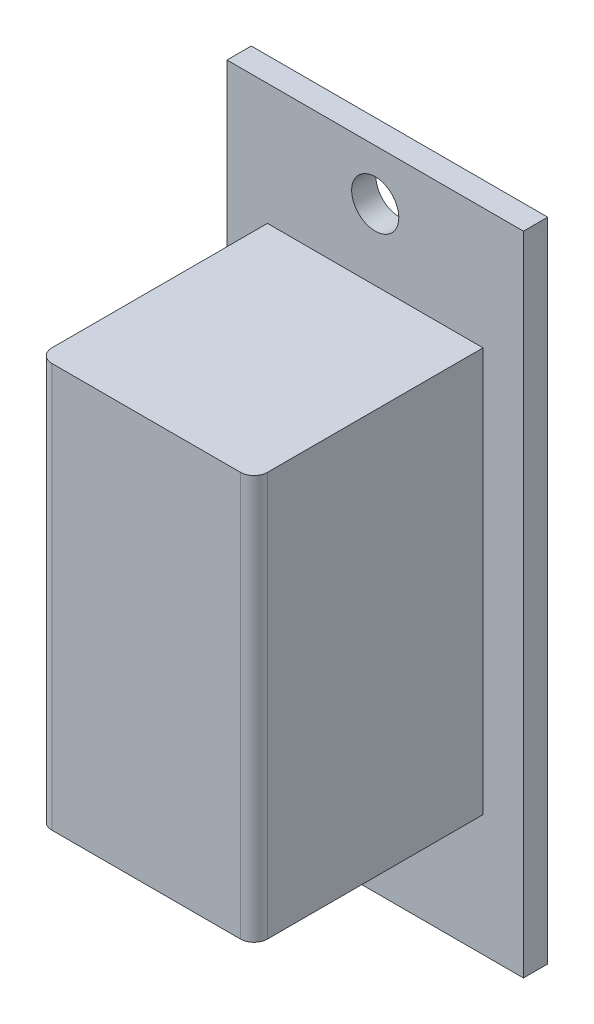
ISO-10303-21;
HEADER;
FILE_DESCRIPTION(('STEP AP214'),'2;1');
FILE_NAME('part.step','',(''),(''),'','','');
FILE_SCHEMA(('AUTOMOTIVE_DESIGN { 1 0 10303 214 1 1 1 1 }'));
ENDSEC;
DATA;
#1=APPLICATION_CONTEXT('core data for automotive mechanical design processes');
#2=APPLICATION_PROTOCOL_DEFINITION('international standard','automotive_design',2000,#1);
#3=PRODUCT_CONTEXT('',#1,'mechanical');
#4=PRODUCT('Part','Part','',(#3));
#5=PRODUCT_RELATED_PRODUCT_CATEGORY('part','',(#4));
#6=PRODUCT_DEFINITION_FORMATION('','',#4);
#7=PRODUCT_DEFINITION_CONTEXT('part definition',#1,'design');
#8=PRODUCT_DEFINITION('design','',#6,#7);
#9=PRODUCT_DEFINITION_SHAPE('','',#8);
#10=(LENGTH_UNIT() NAMED_UNIT(*) SI_UNIT(.MILLI.,.METRE.));
#11=(NAMED_UNIT(*) PLANE_ANGLE_UNIT() SI_UNIT($,.RADIAN.));
#12=(NAMED_UNIT(*) SI_UNIT($,.STERADIAN.) SOLID_ANGLE_UNIT());
#13=UNCERTAINTY_MEASURE_WITH_UNIT(LENGTH_MEASURE(1.E-05),#10,'distance_accuracy_value','');
#14=(GEOMETRIC_REPRESENTATION_CONTEXT(3) GLOBAL_UNCERTAINTY_ASSIGNED_CONTEXT((#13)) GLOBAL_UNIT_ASSIGNED_CONTEXT((#10,
#11,#12)) REPRESENTATION_CONTEXT('',''));
#15=CARTESIAN_POINT('',(0.,0.,0.));
#16=DIRECTION('',(0.,0.,1.));
#17=DIRECTION('',(1.,0.,0.));
#18=AXIS2_PLACEMENT_3D('',#15,#16,#17);
#19=CARTESIAN_POINT('',(-11.,-24.,1.8));
#20=DIRECTION('',(0.,0.,1.));
#21=DIRECTION('',(1.,0.,0.));
#22=AXIS2_PLACEMENT_3D('',#19,#20,#21);
#23=PLANE('',#22);
#24=CARTESIAN_POINT('',(0.,-20.25,1.8));
#25=DIRECTION('',(0.,0.,1.));
#26=DIRECTION('',(-1.,0.,0.));
#27=AXIS2_PLACEMENT_3D('',#24,#25,#26);
#28=CIRCLE('',#27,1.75);
#29=CARTESIAN_POINT('',(-1.75,-20.25,1.8));
#30=VERTEX_POINT('',#29);
#31=EDGE_CURVE('E144',#30,#30,#28,.T.);
#32=ORIENTED_EDGE('',*,*,#31,.F.);
#33=EDGE_LOOP('',(#32));
#34=FACE_BOUND('',#33,.T.);
#35=DIRECTION('',(0.,-1.,0.));
#36=VECTOR('',#35,1.);
#37=CARTESIAN_POINT('',(-11.,24.,1.8));
#38=LINE('',#37,#36);
#39=CARTESIAN_POINT('',(-11.,24.,1.8));
#40=VERTEX_POINT('',#39);
#41=CARTESIAN_POINT('',(-11.,-24.,1.8));
#42=VERTEX_POINT('',#41);
#43=EDGE_CURVE('E162',#40,#42,#38,.T.);
#44=ORIENTED_EDGE('',*,*,#43,.T.);
#45=DIRECTION('',(1.,0.,0.));
#46=VECTOR('',#45,1.);
#47=CARTESIAN_POINT('',(-11.,-24.,1.8));
#48=LINE('',#47,#46);
#49=CARTESIAN_POINT('',(11.,-24.,1.8));
#50=VERTEX_POINT('',#49);
#51=EDGE_CURVE('E165',#42,#50,#48,.T.);
#52=ORIENTED_EDGE('',*,*,#51,.T.);
#53=DIRECTION('',(0.,1.,0.));
#54=VECTOR('',#53,1.);
#55=CARTESIAN_POINT('',(11.,-24.,1.8));
#56=LINE('',#55,#54);
#57=CARTESIAN_POINT('',(11.,24.,1.8));
#58=VERTEX_POINT('',#57);
#59=EDGE_CURVE('E167',#50,#58,#56,.T.);
#60=ORIENTED_EDGE('',*,*,#59,.T.);
#61=DIRECTION('',(-1.,0.,0.));
#62=VECTOR('',#61,1.);
#63=CARTESIAN_POINT('',(-11.,24.,1.8));
#64=LINE('',#63,#62);
#65=EDGE_CURVE('E169',#58,#40,#64,.T.);
#66=ORIENTED_EDGE('',*,*,#65,.T.);
#67=EDGE_LOOP('',(#44,#52,#60,#66));
#68=FACE_BOUND('',#67,.T.);
#69=CARTESIAN_POINT('',(0.,20.25,1.8));
#70=DIRECTION('',(0.,0.,1.));
#71=DIRECTION('',(1.,0.,0.));
#72=AXIS2_PLACEMENT_3D('',#69,#70,#71);
#73=CIRCLE('',#72,1.75);
#74=CARTESIAN_POINT('',(1.75,20.25,1.8));
#75=VERTEX_POINT('',#74);
#76=EDGE_CURVE('E150',#75,#75,#73,.T.);
#77=ORIENTED_EDGE('',*,*,#76,.F.);
#78=EDGE_LOOP('',(#77));
#79=FACE_BOUND('',#78,.T.);
#80=DIRECTION('',(1.,0.,0.));
#81=VECTOR('',#80,1.);
#82=CARTESIAN_POINT('',(-8.,-15.,1.8));
#83=LINE('',#82,#81);
#84=CARTESIAN_POINT('',(-8.,-15.,1.8));
#85=VERTEX_POINT('',#84);
#86=CARTESIAN_POINT('',(8.00000000000001,-15.,1.8));
#87=VERTEX_POINT('',#86);
#88=EDGE_CURVE('E111',#85,#87,#83,.T.);
#89=ORIENTED_EDGE('',*,*,#88,.F.);
#90=DIRECTION('',(0.,-1.,0.));
#91=VECTOR('',#90,1.);
#92=CARTESIAN_POINT('',(-8.,15.,1.8));
#93=LINE('',#92,#91);
#94=CARTESIAN_POINT('',(-8.,15.,1.8));
#95=VERTEX_POINT('',#94);
#96=EDGE_CURVE('E118',#95,#85,#93,.T.);
#97=ORIENTED_EDGE('',*,*,#96,.F.);
#98=DIRECTION('',(-1.,0.,0.));
#99=VECTOR('',#98,1.);
#100=CARTESIAN_POINT('',(-8.,15.,1.8));
#101=LINE('',#100,#99);
#102=CARTESIAN_POINT('',(8.,15.,1.8));
#103=VERTEX_POINT('',#102);
#104=EDGE_CURVE('E128',#103,#95,#101,.T.);
#105=ORIENTED_EDGE('',*,*,#104,.F.);
#106=DIRECTION('',(0.,1.,0.));
#107=VECTOR('',#106,1.);
#108=CARTESIAN_POINT('',(8.00000000000001,-15.,1.8));
#109=LINE('',#108,#107);
#110=EDGE_CURVE('E126',#87,#103,#109,.T.);
#111=ORIENTED_EDGE('',*,*,#110,.F.);
#112=EDGE_LOOP('',(#89,#97,#105,#111));
#113=FACE_BOUND('',#112,.T.);
#114=ADVANCED_FACE('F29',(#34,#68,#79,#113),#23,.T.);
#115=CARTESIAN_POINT('',(-11.,-24.,0.));
#116=DIRECTION('',(0.,0.,1.));
#117=DIRECTION('',(1.,0.,0.));
#118=AXIS2_PLACEMENT_3D('',#115,#116,#117);
#119=PLANE('',#118);
#120=CARTESIAN_POINT('',(0.,20.25,0.));
#121=DIRECTION('',(0.,0.,1.));
#122=DIRECTION('',(1.,0.,0.));
#123=AXIS2_PLACEMENT_3D('',#120,#121,#122);
#124=CIRCLE('',#123,1.75);
#125=CARTESIAN_POINT('',(1.75,20.25,0.));
#126=VERTEX_POINT('',#125);
#127=EDGE_CURVE('E147',#126,#126,#124,.T.);
#128=ORIENTED_EDGE('',*,*,#127,.T.);
#129=EDGE_LOOP('',(#128));
#130=FACE_BOUND('',#129,.T.);
#131=DIRECTION('',(0.,-1.,0.));
#132=VECTOR('',#131,1.);
#133=CARTESIAN_POINT('',(-11.,24.,0.));
#134=LINE('',#133,#132);
#135=CARTESIAN_POINT('',(-11.,24.,0.));
#136=VERTEX_POINT('',#135);
#137=CARTESIAN_POINT('',(-11.,-24.,0.));
#138=VERTEX_POINT('',#137);
#139=EDGE_CURVE('E153',#136,#138,#134,.T.);
#140=ORIENTED_EDGE('',*,*,#139,.F.);
#141=DIRECTION('',(-1.,0.,0.));
#142=VECTOR('',#141,1.);
#143=CARTESIAN_POINT('',(-11.,24.,0.));
#144=LINE('',#143,#142);
#145=CARTESIAN_POINT('',(11.,24.,0.));
#146=VERTEX_POINT('',#145);
#147=EDGE_CURVE('E160',#146,#136,#144,.T.);
#148=ORIENTED_EDGE('',*,*,#147,.F.);
#149=DIRECTION('',(0.,1.,0.));
#150=VECTOR('',#149,1.);
#151=CARTESIAN_POINT('',(11.,-24.,0.));
#152=LINE('',#151,#150);
#153=CARTESIAN_POINT('',(11.,-24.,0.));
#154=VERTEX_POINT('',#153);
#155=EDGE_CURVE('E158',#154,#146,#152,.T.);
#156=ORIENTED_EDGE('',*,*,#155,.F.);
#157=DIRECTION('',(1.,0.,0.));
#158=VECTOR('',#157,1.);
#159=CARTESIAN_POINT('',(-11.,-24.,0.));
#160=LINE('',#159,#158);
#161=EDGE_CURVE('E156',#138,#154,#160,.T.);
#162=ORIENTED_EDGE('',*,*,#161,.F.);
#163=EDGE_LOOP('',(#140,#148,#156,#162));
#164=FACE_BOUND('',#163,.T.);
#165=CARTESIAN_POINT('',(0.,-20.25,0.));
#166=DIRECTION('',(0.,0.,1.));
#167=DIRECTION('',(-1.,0.,0.));
#168=AXIS2_PLACEMENT_3D('',#165,#166,#167);
#169=CIRCLE('',#168,1.75);
#170=CARTESIAN_POINT('',(-1.75,-20.25,0.));
#171=VERTEX_POINT('',#170);
#172=EDGE_CURVE('E114',#171,#171,#169,.T.);
#173=ORIENTED_EDGE('',*,*,#172,.T.);
#174=EDGE_LOOP('',(#173));
#175=FACE_BOUND('',#174,.T.);
#176=ADVANCED_FACE('F212',(#130,#164,#175),#119,.F.);
#177=CARTESIAN_POINT('',(-11.,24.,1.8));
#178=DIRECTION('',(1.,0.,0.));
#179=DIRECTION('',(0.,0.,-1.));
#180=AXIS2_PLACEMENT_3D('',#177,#178,#179);
#181=PLANE('',#180);
#182=ORIENTED_EDGE('',*,*,#139,.T.);
#183=DIRECTION('',(0.,0.,-1.));
#184=VECTOR('',#183,1.);
#185=CARTESIAN_POINT('',(-11.,-24.,1.8));
#186=LINE('',#185,#184);
#187=EDGE_CURVE('E180',#42,#138,#186,.T.);
#188=ORIENTED_EDGE('',*,*,#187,.F.);
#189=ORIENTED_EDGE('',*,*,#43,.F.);
#190=DIRECTION('',(0.,0.,-1.));
#191=VECTOR('',#190,1.);
#192=CARTESIAN_POINT('',(-11.,24.,1.8));
#193=LINE('',#192,#191);
#194=EDGE_CURVE('E171',#40,#136,#193,.T.);
#195=ORIENTED_EDGE('',*,*,#194,.T.);
#196=EDGE_LOOP('',(#182,#188,#189,#195));
#197=FACE_BOUND('',#196,.T.);
#198=ADVANCED_FACE('F31',(#197),#181,.F.);
#199=CARTESIAN_POINT('',(-11.,-24.,1.8));
#200=DIRECTION('',(0.,1.,0.));
#201=DIRECTION('',(-1.,0.,0.));
#202=AXIS2_PLACEMENT_3D('',#199,#200,#201);
#203=PLANE('',#202);
#204=ORIENTED_EDGE('',*,*,#161,.T.);
#205=DIRECTION('',(0.,0.,-1.));
#206=VECTOR('',#205,1.);
#207=CARTESIAN_POINT('',(11.,-24.,1.8));
#208=LINE('',#207,#206);
#209=EDGE_CURVE('E177',#50,#154,#208,.T.);
#210=ORIENTED_EDGE('',*,*,#209,.F.);
#211=ORIENTED_EDGE('',*,*,#51,.F.);
#212=ORIENTED_EDGE('',*,*,#187,.T.);
#213=EDGE_LOOP('',(#204,#210,#211,#212));
#214=FACE_BOUND('',#213,.T.);
#215=ADVANCED_FACE('F233',(#214),#203,.F.);
#216=CARTESIAN_POINT('',(11.,-24.,1.8));
#217=DIRECTION('',(-1.,0.,0.));
#218=DIRECTION('',(0.,-1.,0.));
#219=AXIS2_PLACEMENT_3D('',#216,#217,#218);
#220=PLANE('',#219);
#221=ORIENTED_EDGE('',*,*,#155,.T.);
#222=DIRECTION('',(0.,0.,-1.));
#223=VECTOR('',#222,1.);
#224=CARTESIAN_POINT('',(11.,24.,1.8));
#225=LINE('',#224,#223);
#226=EDGE_CURVE('E174',#58,#146,#225,.T.);
#227=ORIENTED_EDGE('',*,*,#226,.F.);
#228=ORIENTED_EDGE('',*,*,#59,.F.);
#229=ORIENTED_EDGE('',*,*,#209,.T.);
#230=EDGE_LOOP('',(#221,#227,#228,#229));
#231=FACE_BOUND('',#230,.T.);
#232=ADVANCED_FACE('F230',(#231),#220,.F.);
#233=CARTESIAN_POINT('',(-11.,24.,1.8));
#234=DIRECTION('',(0.,-1.,0.));
#235=DIRECTION('',(1.,0.,0.));
#236=AXIS2_PLACEMENT_3D('',#233,#234,#235);
#237=PLANE('',#236);
#238=ORIENTED_EDGE('',*,*,#147,.T.);
#239=ORIENTED_EDGE('',*,*,#194,.F.);
#240=ORIENTED_EDGE('',*,*,#65,.F.);
#241=ORIENTED_EDGE('',*,*,#226,.T.);
#242=EDGE_LOOP('',(#238,#239,#240,#241));
#243=FACE_BOUND('',#242,.T.);
#244=ADVANCED_FACE('F226',(#243),#237,.F.);
#245=CARTESIAN_POINT('',(0.,20.25,1.8));
#246=DIRECTION('',(0.,0.,-1.));
#247=DIRECTION('',(-1.,0.,0.));
#248=AXIS2_PLACEMENT_3D('',#245,#246,#247);
#249=CYLINDRICAL_SURFACE('',#248,1.75);
#250=ORIENTED_EDGE('',*,*,#76,.T.);
#251=EDGE_LOOP('',(#250));
#252=FACE_BOUND('',#251,.T.);
#253=ORIENTED_EDGE('',*,*,#127,.F.);
#254=EDGE_LOOP('',(#253));
#255=FACE_BOUND('',#254,.T.);
#256=ADVANCED_FACE('F229',(#252,#255),#249,.F.);
#257=CARTESIAN_POINT('',(0.,-20.25,1.8));
#258=DIRECTION('',(0.,0.,-1.));
#259=DIRECTION('',(-1.,0.,0.));
#260=AXIS2_PLACEMENT_3D('',#257,#258,#259);
#261=CYLINDRICAL_SURFACE('',#260,1.75);
#262=ORIENTED_EDGE('',*,*,#31,.T.);
#263=EDGE_LOOP('',(#262));
#264=FACE_BOUND('',#263,.T.);
#265=ORIENTED_EDGE('',*,*,#172,.F.);
#266=EDGE_LOOP('',(#265));
#267=FACE_BOUND('',#266,.T.);
#268=ADVANCED_FACE('F258',(#264,#267),#261,.F.);
#269=CARTESIAN_POINT('',(-8.,15.,18.8));
#270=DIRECTION('',(1.,0.,0.));
#271=DIRECTION('',(0.,1.,0.));
#272=AXIS2_PLACEMENT_3D('',#269,#270,#271);
#273=PLANE('',#272);
#274=DIRECTION('',(0.,0.,-1.));
#275=VECTOR('',#274,1.);
#276=CARTESIAN_POINT('',(-8.,-15.,18.8));
#277=LINE('',#276,#275);
#278=CARTESIAN_POINT('',(-8.,-15.,17.8));
#279=VERTEX_POINT('',#278);
#280=EDGE_CURVE('E105',#279,#85,#277,.T.);
#281=ORIENTED_EDGE('',*,*,#280,.F.);
#282=DIRECTION('',(0.,-1.,0.));
#283=VECTOR('',#282,1.);
#284=CARTESIAN_POINT('',(-8.,15.,17.8));
#285=LINE('',#284,#283);
#286=CARTESIAN_POINT('',(-8.,15.,17.8));
#287=VERTEX_POINT('',#286);
#288=EDGE_CURVE('E52',#279,#287,#285,.F.);
#289=ORIENTED_EDGE('',*,*,#288,.T.);
#290=DIRECTION('',(0.,0.,-1.));
#291=VECTOR('',#290,1.);
#292=CARTESIAN_POINT('',(-8.,15.,18.8));
#293=LINE('',#292,#291);
#294=EDGE_CURVE('E120',#287,#95,#293,.T.);
#295=ORIENTED_EDGE('',*,*,#294,.T.);
#296=ORIENTED_EDGE('',*,*,#96,.T.);
#297=EDGE_LOOP('',(#281,#289,#295,#296));
#298=FACE_BOUND('',#297,.T.);
#299=ADVANCED_FACE('F119',(#298),#273,.F.);
#300=CARTESIAN_POINT('',(-8.,-15.,18.8));
#301=DIRECTION('',(0.,1.,0.));
#302=DIRECTION('',(-1.,0.,0.));
#303=AXIS2_PLACEMENT_3D('',#300,#301,#302);
#304=PLANE('',#303);
#305=DIRECTION('',(1.,0.,0.));
#306=VECTOR('',#305,1.);
#307=CARTESIAN_POINT('',(-8.,-15.,18.8));
#308=LINE('',#307,#306);
#309=CARTESIAN_POINT('',(-7.,-15.,18.8));
#310=VERTEX_POINT('',#309);
#311=CARTESIAN_POINT('',(7.00000000000001,-15.,18.8));
#312=VERTEX_POINT('',#311);
#313=EDGE_CURVE('E132',#310,#312,#308,.T.);
#314=ORIENTED_EDGE('',*,*,#313,.F.);
#315=CARTESIAN_POINT('',(-7.,-15.,17.8));
#316=DIRECTION('',(0.,1.,0.));
#317=DIRECTION('',(-1.,0.,0.));
#318=AXIS2_PLACEMENT_3D('',#315,#316,#317);
#319=CIRCLE('',#318,1.);
#320=EDGE_CURVE('E113',#310,#279,#319,.F.);
#321=ORIENTED_EDGE('',*,*,#320,.T.);
#322=ORIENTED_EDGE('',*,*,#280,.T.);
#323=ORIENTED_EDGE('',*,*,#88,.T.);
#324=DIRECTION('',(0.,0.,-1.));
#325=VECTOR('',#324,1.);
#326=CARTESIAN_POINT('',(8.00000000000001,-15.,18.8));
#327=LINE('',#326,#325);
#328=CARTESIAN_POINT('',(8.00000000000001,-15.,17.8));
#329=VERTEX_POINT('',#328);
#330=EDGE_CURVE('E115',#329,#87,#327,.T.);
#331=ORIENTED_EDGE('',*,*,#330,.F.);
#332=CARTESIAN_POINT('',(7.00000000000001,-15.,17.8));
#333=DIRECTION('',(0.,1.,0.));
#334=DIRECTION('',(-1.,0.,0.));
#335=AXIS2_PLACEMENT_3D('',#332,#333,#334);
#336=CIRCLE('',#335,1.);
#337=EDGE_CURVE('E189',#329,#312,#336,.F.);
#338=ORIENTED_EDGE('',*,*,#337,.T.);
#339=EDGE_LOOP('',(#314,#321,#322,#323,#331,#338));
#340=FACE_BOUND('',#339,.T.);
#341=ADVANCED_FACE('F108',(#340),#304,.F.);
#342=CARTESIAN_POINT('',(8.00000000000001,-15.,18.8));
#343=DIRECTION('',(-1.,0.,0.));
#344=DIRECTION('',(0.,-1.,0.));
#345=AXIS2_PLACEMENT_3D('',#342,#343,#344);
#346=PLANE('',#345);
#347=DIRECTION('',(0.,0.,-1.));
#348=VECTOR('',#347,1.);
#349=CARTESIAN_POINT('',(8.,15.,18.8));
#350=LINE('',#349,#348);
#351=CARTESIAN_POINT('',(8.,15.,17.8));
#352=VERTEX_POINT('',#351);
#353=EDGE_CURVE('E139',#352,#103,#350,.T.);
#354=ORIENTED_EDGE('',*,*,#353,.F.);
#355=DIRECTION('',(0.,1.,0.));
#356=VECTOR('',#355,1.);
#357=CARTESIAN_POINT('',(8.00000000000001,-15.,17.8));
#358=LINE('',#357,#356);
#359=EDGE_CURVE('E11',#352,#329,#358,.F.);
#360=ORIENTED_EDGE('',*,*,#359,.T.);
#361=ORIENTED_EDGE('',*,*,#330,.T.);
#362=ORIENTED_EDGE('',*,*,#110,.T.);
#363=EDGE_LOOP('',(#354,#360,#361,#362));
#364=FACE_BOUND('',#363,.T.);
#365=ADVANCED_FACE('F268',(#364),#346,.F.);
#366=CARTESIAN_POINT('',(-8.,15.,18.8));
#367=DIRECTION('',(0.,-1.,0.));
#368=DIRECTION('',(0.,0.,-1.));
#369=AXIS2_PLACEMENT_3D('',#366,#367,#368);
#370=PLANE('',#369);
#371=ORIENTED_EDGE('',*,*,#294,.F.);
#372=CARTESIAN_POINT('',(-7.,15.,17.8));
#373=DIRECTION('',(0.,-1.,0.));
#374=DIRECTION('',(0.,0.,-1.));
#375=AXIS2_PLACEMENT_3D('',#372,#373,#374);
#376=CIRCLE('',#375,1.);
#377=CARTESIAN_POINT('',(-7.,15.,18.8));
#378=VERTEX_POINT('',#377);
#379=EDGE_CURVE('E37',#287,#378,#376,.F.);
#380=ORIENTED_EDGE('',*,*,#379,.T.);
#381=DIRECTION('',(-1.,0.,0.));
#382=VECTOR('',#381,1.);
#383=CARTESIAN_POINT('',(-8.,15.,18.8));
#384=LINE('',#383,#382);
#385=CARTESIAN_POINT('',(7.,15.,18.8));
#386=VERTEX_POINT('',#385);
#387=EDGE_CURVE('E135',#386,#378,#384,.T.);
#388=ORIENTED_EDGE('',*,*,#387,.F.);
#389=CARTESIAN_POINT('',(7.,15.,17.8));
#390=DIRECTION('',(0.,-1.,0.));
#391=DIRECTION('',(0.,0.,-1.));
#392=AXIS2_PLACEMENT_3D('',#389,#390,#391);
#393=CIRCLE('',#392,1.);
#394=EDGE_CURVE('E44',#386,#352,#393,.F.);
#395=ORIENTED_EDGE('',*,*,#394,.T.);
#396=ORIENTED_EDGE('',*,*,#353,.T.);
#397=ORIENTED_EDGE('',*,*,#104,.T.);
#398=EDGE_LOOP('',(#371,#380,#388,#395,#396,#397));
#399=FACE_BOUND('',#398,.T.);
#400=ADVANCED_FACE('F194',(#399),#370,.F.);
#401=CARTESIAN_POINT('',(-8.,15.,18.8));
#402=DIRECTION('',(0.,0.,1.));
#403=DIRECTION('',(1.,0.,0.));
#404=AXIS2_PLACEMENT_3D('',#401,#402,#403);
#405=PLANE('',#404);
#406=ORIENTED_EDGE('',*,*,#387,.T.);
#407=DIRECTION('',(0.,-1.,0.));
#408=VECTOR('',#407,1.);
#409=CARTESIAN_POINT('',(-7.,-15.,18.8));
#410=LINE('',#409,#408);
#411=EDGE_CURVE('E186',#378,#310,#410,.T.);
#412=ORIENTED_EDGE('',*,*,#411,.T.);
#413=ORIENTED_EDGE('',*,*,#313,.T.);
#414=DIRECTION('',(0.,1.,0.));
#415=VECTOR('',#414,1.);
#416=CARTESIAN_POINT('',(7.,15.,18.8));
#417=LINE('',#416,#415);
#418=EDGE_CURVE('E183',#312,#386,#417,.T.);
#419=ORIENTED_EDGE('',*,*,#418,.T.);
#420=EDGE_LOOP('',(#406,#412,#413,#419));
#421=FACE_BOUND('',#420,.T.);
#422=ADVANCED_FACE('F198',(#421),#405,.T.);
#423=CARTESIAN_POINT('',(-7.,15.,17.8));
#424=DIRECTION('',(0.,1.,0.));
#425=DIRECTION('',(-1.,0.,0.));
#426=AXIS2_PLACEMENT_3D('',#423,#424,#425);
#427=CYLINDRICAL_SURFACE('',#426,1.);
#428=ORIENTED_EDGE('',*,*,#379,.F.);
#429=ORIENTED_EDGE('',*,*,#288,.F.);
#430=ORIENTED_EDGE('',*,*,#320,.F.);
#431=ORIENTED_EDGE('',*,*,#411,.F.);
#432=EDGE_LOOP('',(#428,#429,#430,#431));
#433=FACE_BOUND('',#432,.T.);
#434=ADVANCED_FACE('F200',(#433),#427,.T.);
#435=CARTESIAN_POINT('',(7.,15.,17.8));
#436=DIRECTION('',(0.,-1.,0.));
#437=DIRECTION('',(1.,0.,0.));
#438=AXIS2_PLACEMENT_3D('',#435,#436,#437);
#439=CYLINDRICAL_SURFACE('',#438,1.);
#440=ORIENTED_EDGE('',*,*,#337,.F.);
#441=ORIENTED_EDGE('',*,*,#359,.F.);
#442=ORIENTED_EDGE('',*,*,#394,.F.);
#443=ORIENTED_EDGE('',*,*,#418,.F.);
#444=EDGE_LOOP('',(#440,#441,#442,#443));
#445=FACE_BOUND('',#444,.T.);
#446=ADVANCED_FACE('F202',(#445),#439,.T.);
#447=CLOSED_SHELL('',(#114,#176,#198,#215,#232,#244,#256,#268,#299,#341,#365,#400,#422,#434,#446));
#448=MANIFOLD_SOLID_BREP('B2',#447);
#449=ADVANCED_BREP_SHAPE_REPRESENTATION('',(#18,#448),#14);
#450=SHAPE_DEFINITION_REPRESENTATION(#9,#449);
ENDSEC;
END-ISO-10303-21;
